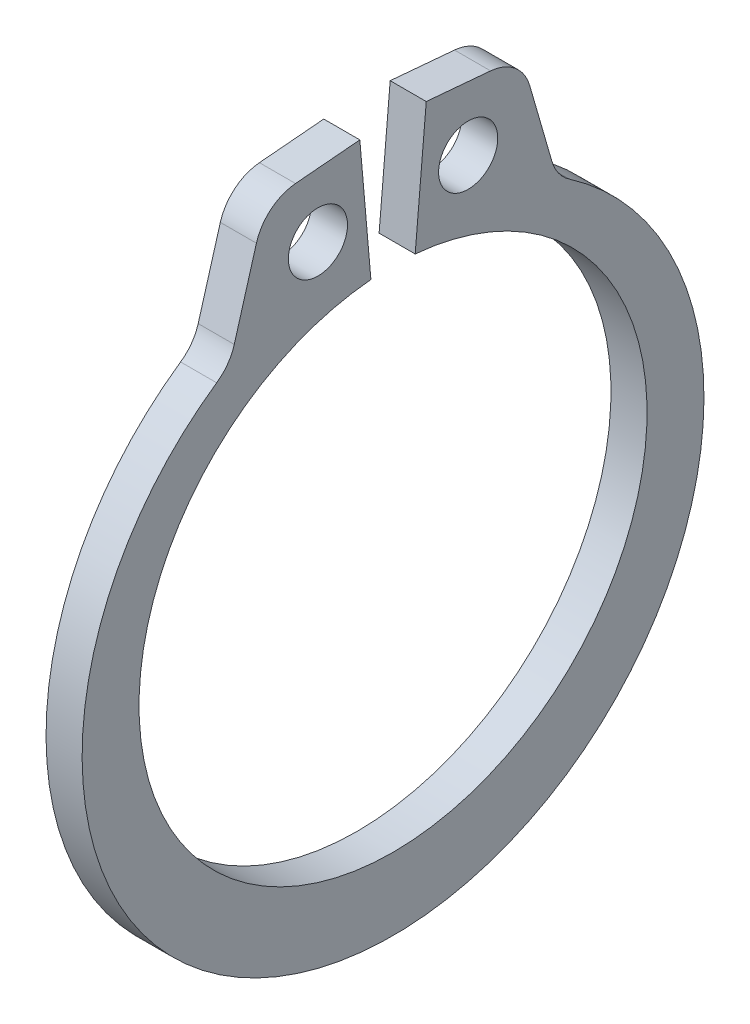
ISO-10303-21;
HEADER;
FILE_DESCRIPTION(('STEP AP214'),'2;1');
FILE_NAME('part.step','',(''),(''),'','','');
FILE_SCHEMA(('AUTOMOTIVE_DESIGN { 1 0 10303 214 1 1 1 1 }'));
ENDSEC;
DATA;
#1=APPLICATION_CONTEXT('core data for automotive mechanical design processes');
#2=APPLICATION_PROTOCOL_DEFINITION('international standard','automotive_design',2000,#1);
#3=PRODUCT_CONTEXT('',#1,'mechanical');
#4=PRODUCT('Part','Part','',(#3));
#5=PRODUCT_RELATED_PRODUCT_CATEGORY('part','',(#4));
#6=PRODUCT_DEFINITION_FORMATION('','',#4);
#7=PRODUCT_DEFINITION_CONTEXT('part definition',#1,'design');
#8=PRODUCT_DEFINITION('design','',#6,#7);
#9=PRODUCT_DEFINITION_SHAPE('','',#8);
#10=(LENGTH_UNIT() NAMED_UNIT(*) SI_UNIT(.MILLI.,.METRE.));
#11=(NAMED_UNIT(*) PLANE_ANGLE_UNIT() SI_UNIT($,.RADIAN.));
#12=(NAMED_UNIT(*) SI_UNIT($,.STERADIAN.) SOLID_ANGLE_UNIT());
#13=UNCERTAINTY_MEASURE_WITH_UNIT(LENGTH_MEASURE(1.E-05),#10,'distance_accuracy_value','');
#14=(GEOMETRIC_REPRESENTATION_CONTEXT(3) GLOBAL_UNCERTAINTY_ASSIGNED_CONTEXT((#13)) GLOBAL_UNIT_ASSIGNED_CONTEXT((#10,
#11,#12)) REPRESENTATION_CONTEXT('',''));
#15=CARTESIAN_POINT('',(0.,0.,0.));
#16=DIRECTION('',(0.,0.,1.));
#17=DIRECTION('',(1.,0.,0.));
#18=AXIS2_PLACEMENT_3D('',#15,#16,#17);
#19=CARTESIAN_POINT('',(0.3175,0.,0.));
#20=DIRECTION('',(1.,0.,0.));
#21=DIRECTION('',(0.,0.,-1.));
#22=AXIS2_PLACEMENT_3D('',#19,#20,#21);
#23=PLANE('',#22);
#24=CARTESIAN_POINT('',(0.3175,5.49368202936559,1.32203668641442));
#25=DIRECTION('',(1.,0.,0.));
#26=DIRECTION('',(0.,0.,-1.));
#27=AXIS2_PLACEMENT_3D('',#24,#25,#26);
#28=CIRCLE('',#27,0.5207);
#29=CARTESIAN_POINT('',(0.3175,5.49368202936559,0.801336686414416));
#30=VERTEX_POINT('',#29);
#31=EDGE_CURVE('E223',#30,#30,#28,.T.);
#32=ORIENTED_EDGE('',*,*,#31,.F.);
#33=EDGE_LOOP('',(#32));
#34=FACE_BOUND('',#33,.T.);
#35=DIRECTION('',(0.,-0.0871557427476588,0.996194698091746));
#36=VECTOR('',#35,1.);
#37=CARTESIAN_POINT('',(0.3175,6.68008316752401,0.584431548568698));
#38=LINE('',#37,#36);
#39=CARTESIAN_POINT('',(0.3175,6.68008316752401,0.584431548568698));
#40=VERTEX_POINT('',#39);
#41=CARTESIAN_POINT('',(0.3175,6.58102849769202,1.71663160558108));
#42=VERTEX_POINT('',#41);
#43=EDGE_CURVE('E135',#40,#42,#38,.T.);
#44=ORIENTED_EDGE('',*,*,#43,.T.);
#45=CARTESIAN_POINT('',(0.3175,5.79662479241458,1.64800517374158));
#46=DIRECTION('',(1.,0.,0.));
#47=DIRECTION('',(0.,0.,-1.));
#48=AXIS2_PLACEMENT_3D('',#45,#46,#47);
#49=CIRCLE('',#48,0.7874);
#50=CARTESIAN_POINT('',(0.3175,6.0153466835661,2.40441742531548));
#51=VERTEX_POINT('',#50);
#52=EDGE_CURVE('E176',#42,#51,#49,.T.);
#53=ORIENTED_EDGE('',*,*,#52,.T.);
#54=DIRECTION('',(0.,-0.96064548078982,0.277777357317144));
#55=VECTOR('',#54,1.);
#56=CARTESIAN_POINT('',(0.3175,6.53397528038183,2.2544523404497));
#57=LINE('',#56,#55);
#58=CARTESIAN_POINT('',(0.3175,4.66724971906374,2.79422908809335));
#59=VERTEX_POINT('',#58);
#60=EDGE_CURVE('E215',#51,#59,#57,.T.);
#61=ORIENTED_EDGE('',*,*,#60,.T.);
#62=CARTESIAN_POINT('',(0.3175,4.88597161021526,3.55064133966726));
#63=DIRECTION('',(1.,0.,0.));
#64=DIRECTION('',(0.,0.,-1.));
#65=AXIS2_PLACEMENT_3D('',#62,#63,#64);
#66=CIRCLE('',#65,0.7874);
#67=CARTESIAN_POINT('',(0.3175,4.23752329507568,3.10397195120119));
#68=VERTEX_POINT('',#67);
#69=EDGE_CURVE('E183',#59,#68,#66,.F.);
#70=ORIENTED_EDGE('',*,*,#69,.T.);
#71=CARTESIAN_POINT('',(0.3175,-0.268640399976461,0.));
#72=DIRECTION('',(1.,0.,0.));
#73=DIRECTION('',(0.,0.,-1.));
#74=AXIS2_PLACEMENT_3D('',#71,#72,#73);
#75=CIRCLE('',#74,5.47175960002354);
#76=CARTESIAN_POINT('',(0.3175,4.23752329507568,-3.10397195120119));
#77=VERTEX_POINT('',#76);
#78=EDGE_CURVE('E208',#68,#77,#75,.T.);
#79=ORIENTED_EDGE('',*,*,#78,.T.);
#80=CARTESIAN_POINT('',(0.3175,4.88597161021526,-3.55064133966726));
#81=DIRECTION('',(1.,0.,0.));
#82=DIRECTION('',(0.,0.,-1.));
#83=AXIS2_PLACEMENT_3D('',#80,#81,#82);
#84=CIRCLE('',#83,0.7874);
#85=CARTESIAN_POINT('',(0.3175,4.66724971906374,-2.79422908809335));
#86=VERTEX_POINT('',#85);
#87=EDGE_CURVE('E11',#77,#86,#84,.F.);
#88=ORIENTED_EDGE('',*,*,#87,.T.);
#89=DIRECTION('',(0.,0.96064548078982,0.277777357317144));
#90=VECTOR('',#89,1.);
#91=CARTESIAN_POINT('',(0.3175,6.53397528038183,-2.2544523404497));
#92=LINE('',#91,#90);
#93=CARTESIAN_POINT('',(0.3175,6.0153466835661,-2.40441742531548));
#94=VERTEX_POINT('',#93);
#95=EDGE_CURVE('E207',#86,#94,#92,.T.);
#96=ORIENTED_EDGE('',*,*,#95,.T.);
#97=CARTESIAN_POINT('',(0.3175,5.79662479241458,-1.64800517374158));
#98=DIRECTION('',(1.,0.,0.));
#99=DIRECTION('',(0.,0.,-1.));
#100=AXIS2_PLACEMENT_3D('',#97,#98,#99);
#101=CIRCLE('',#100,0.7874);
#102=CARTESIAN_POINT('',(0.3175,6.58102849769202,-1.71663160558108));
#103=VERTEX_POINT('',#102);
#104=EDGE_CURVE('E51',#94,#103,#101,.T.);
#105=ORIENTED_EDGE('',*,*,#104,.T.);
#106=DIRECTION('',(0.,0.0871557427476583,0.996194698091746));
#107=VECTOR('',#106,1.);
#108=CARTESIAN_POINT('',(0.3175,6.68008316752401,-0.584431548568698));
#109=LINE('',#108,#107);
#110=CARTESIAN_POINT('',(0.3175,6.68008316752401,-0.584431548568698));
#111=VERTEX_POINT('',#110);
#112=EDGE_CURVE('E212',#103,#111,#109,.T.);
#113=ORIENTED_EDGE('',*,*,#112,.T.);
#114=DIRECTION('',(0.,-0.996194698091745,0.0871557427476584));
#115=VECTOR('',#114,1.);
#116=CARTESIAN_POINT('',(0.3175,4.45338877834934,-0.389621032379132));
#117=LINE('',#116,#115);
#118=CARTESIAN_POINT('',(0.3175,4.45338877834934,-0.389621032379132));
#119=VERTEX_POINT('',#118);
#120=EDGE_CURVE('E141',#111,#119,#117,.T.);
#121=ORIENTED_EDGE('',*,*,#120,.T.);
#122=CARTESIAN_POINT('',(0.3175,0.,0.));
#123=DIRECTION('',(-1.,0.,0.));
#124=DIRECTION('',(0.,0.,-1.));
#125=AXIS2_PLACEMENT_3D('',#122,#123,#124);
#126=CIRCLE('',#125,4.4704);
#127=CARTESIAN_POINT('',(0.3175,4.45338877834934,0.389621032379132));
#128=VERTEX_POINT('',#127);
#129=EDGE_CURVE('E136',#119,#128,#126,.T.);
#130=ORIENTED_EDGE('',*,*,#129,.T.);
#131=DIRECTION('',(0.,0.996194698091745,0.0871557427476584));
#132=VECTOR('',#131,1.);
#133=CARTESIAN_POINT('',(0.3175,4.45338877834934,0.389621032379132));
#134=LINE('',#133,#132);
#135=EDGE_CURVE('E127',#128,#40,#134,.T.);
#136=ORIENTED_EDGE('',*,*,#135,.T.);
#137=EDGE_LOOP('',(#44,#53,#61,#70,#79,#88,#96,#105,#113,#121,#130,#136));
#138=FACE_BOUND('',#137,.T.);
#139=CARTESIAN_POINT('',(0.3175,5.49368202936559,-1.32203668641442));
#140=DIRECTION('',(1.,0.,0.));
#141=DIRECTION('',(0.,0.,-1.));
#142=AXIS2_PLACEMENT_3D('',#139,#140,#141);
#143=CIRCLE('',#142,0.5207);
#144=CARTESIAN_POINT('',(0.3175,5.49368202936559,-1.84273668641442));
#145=VERTEX_POINT('',#144);
#146=EDGE_CURVE('E249',#145,#145,#143,.T.);
#147=ORIENTED_EDGE('',*,*,#146,.F.);
#148=EDGE_LOOP('',(#147));
#149=FACE_BOUND('',#148,.T.);
#150=ADVANCED_FACE('F36',(#34,#138,#149),#23,.T.);
#151=CARTESIAN_POINT('',(-0.3175,0.,0.));
#152=DIRECTION('',(1.,0.,0.));
#153=DIRECTION('',(0.,0.,-1.));
#154=AXIS2_PLACEMENT_3D('',#151,#152,#153);
#155=PLANE('',#154);
#156=DIRECTION('',(0.,-0.96064548078982,0.277777357317144));
#157=VECTOR('',#156,1.);
#158=CARTESIAN_POINT('',(-0.3175,6.53397528038183,2.2544523404497));
#159=LINE('',#158,#157);
#160=CARTESIAN_POINT('',(-0.3175,6.0153466835661,2.40441742531548));
#161=VERTEX_POINT('',#160);
#162=CARTESIAN_POINT('',(-0.3175,4.66724971906374,2.79422908809335));
#163=VERTEX_POINT('',#162);
#164=EDGE_CURVE('E202',#161,#163,#159,.T.);
#165=ORIENTED_EDGE('',*,*,#164,.F.);
#166=CARTESIAN_POINT('',(-0.3175,5.79662479241458,1.64800517374158));
#167=DIRECTION('',(1.,0.,0.));
#168=DIRECTION('',(0.,0.,-1.));
#169=AXIS2_PLACEMENT_3D('',#166,#167,#168);
#170=CIRCLE('',#169,0.7874);
#171=CARTESIAN_POINT('',(-0.3175,6.58102849769202,1.71663160558108));
#172=VERTEX_POINT('',#171);
#173=EDGE_CURVE('E172',#161,#172,#170,.F.);
#174=ORIENTED_EDGE('',*,*,#173,.T.);
#175=DIRECTION('',(0.,-0.0871557427476588,0.996194698091746));
#176=VECTOR('',#175,1.);
#177=CARTESIAN_POINT('',(-0.3175,6.68008316752401,0.584431548568698));
#178=LINE('',#177,#176);
#179=CARTESIAN_POINT('',(-0.3175,6.68008316752401,0.584431548568698));
#180=VERTEX_POINT('',#179);
#181=EDGE_CURVE('E225',#180,#172,#178,.T.);
#182=ORIENTED_EDGE('',*,*,#181,.F.);
#183=DIRECTION('',(0.,0.996194698091745,0.0871557427476584));
#184=VECTOR('',#183,1.);
#185=CARTESIAN_POINT('',(-0.3175,4.45338877834934,0.389621032379132));
#186=LINE('',#185,#184);
#187=CARTESIAN_POINT('',(-0.3175,4.45338877834934,0.389621032379132));
#188=VERTEX_POINT('',#187);
#189=EDGE_CURVE('E222',#188,#180,#186,.T.);
#190=ORIENTED_EDGE('',*,*,#189,.F.);
#191=CARTESIAN_POINT('',(-0.3175,0.,0.));
#192=DIRECTION('',(-1.,0.,0.));
#193=DIRECTION('',(0.,0.,-1.));
#194=AXIS2_PLACEMENT_3D('',#191,#192,#193);
#195=CIRCLE('',#194,4.4704);
#196=CARTESIAN_POINT('',(-0.3175,4.45338877834934,-0.389621032379132));
#197=VERTEX_POINT('',#196);
#198=EDGE_CURVE('E149',#197,#188,#195,.T.);
#199=ORIENTED_EDGE('',*,*,#198,.F.);
#200=DIRECTION('',(0.,-0.996194698091745,0.0871557427476584));
#201=VECTOR('',#200,1.);
#202=CARTESIAN_POINT('',(-0.3175,4.45338877834934,-0.389621032379132));
#203=LINE('',#202,#201);
#204=CARTESIAN_POINT('',(-0.3175,6.68008316752401,-0.584431548568698));
#205=VERTEX_POINT('',#204);
#206=EDGE_CURVE('E145',#205,#197,#203,.T.);
#207=ORIENTED_EDGE('',*,*,#206,.F.);
#208=DIRECTION('',(0.,0.0871557427476583,0.996194698091746));
#209=VECTOR('',#208,1.);
#210=CARTESIAN_POINT('',(-0.3175,6.68008316752401,-0.584431548568698));
#211=LINE('',#210,#209);
#212=CARTESIAN_POINT('',(-0.3175,6.58102849769202,-1.71663160558108));
#213=VERTEX_POINT('',#212);
#214=EDGE_CURVE('E230',#213,#205,#211,.T.);
#215=ORIENTED_EDGE('',*,*,#214,.F.);
#216=CARTESIAN_POINT('',(-0.3175,5.79662479241458,-1.64800517374158));
#217=DIRECTION('',(1.,0.,0.));
#218=DIRECTION('',(0.,0.,-1.));
#219=AXIS2_PLACEMENT_3D('',#216,#217,#218);
#220=CIRCLE('',#219,0.7874);
#221=CARTESIAN_POINT('',(-0.3175,6.0153466835661,-2.40441742531548));
#222=VERTEX_POINT('',#221);
#223=EDGE_CURVE('E170',#213,#222,#220,.F.);
#224=ORIENTED_EDGE('',*,*,#223,.T.);
#225=DIRECTION('',(0.,0.96064548078982,0.277777357317144));
#226=VECTOR('',#225,1.);
#227=CARTESIAN_POINT('',(-0.3175,6.53397528038183,-2.2544523404497));
#228=LINE('',#227,#226);
#229=CARTESIAN_POINT('',(-0.3175,4.66724971906374,-2.79422908809335));
#230=VERTEX_POINT('',#229);
#231=EDGE_CURVE('E193',#230,#222,#228,.T.);
#232=ORIENTED_EDGE('',*,*,#231,.F.);
#233=CARTESIAN_POINT('',(-0.3175,4.88597161021526,-3.55064133966726));
#234=DIRECTION('',(1.,0.,0.));
#235=DIRECTION('',(0.,0.,-1.));
#236=AXIS2_PLACEMENT_3D('',#233,#234,#235);
#237=CIRCLE('',#236,0.7874);
#238=CARTESIAN_POINT('',(-0.3175,4.23752329507568,-3.10397195120119));
#239=VERTEX_POINT('',#238);
#240=EDGE_CURVE('E44',#230,#239,#237,.T.);
#241=ORIENTED_EDGE('',*,*,#240,.T.);
#242=CARTESIAN_POINT('',(-0.3175,-0.268640399976461,0.));
#243=DIRECTION('',(1.,0.,0.));
#244=DIRECTION('',(0.,0.,-1.));
#245=AXIS2_PLACEMENT_3D('',#242,#243,#244);
#246=CIRCLE('',#245,5.47175960002354);
#247=CARTESIAN_POINT('',(-0.3175,4.23752329507568,3.10397195120119));
#248=VERTEX_POINT('',#247);
#249=EDGE_CURVE('E191',#248,#239,#246,.T.);
#250=ORIENTED_EDGE('',*,*,#249,.F.);
#251=CARTESIAN_POINT('',(-0.3175,4.88597161021526,3.55064133966726));
#252=DIRECTION('',(1.,0.,0.));
#253=DIRECTION('',(0.,0.,-1.));
#254=AXIS2_PLACEMENT_3D('',#251,#252,#253);
#255=CIRCLE('',#254,0.7874);
#256=EDGE_CURVE('E181',#248,#163,#255,.T.);
#257=ORIENTED_EDGE('',*,*,#256,.T.);
#258=EDGE_LOOP('',(#165,#174,#182,#190,#199,#207,#215,#224,#232,#241,#250,#257));
#259=FACE_BOUND('',#258,.T.);
#260=CARTESIAN_POINT('',(-0.3175,5.49368202936559,1.32203668641442));
#261=DIRECTION('',(1.,0.,0.));
#262=DIRECTION('',(0.,0.,-1.));
#263=AXIS2_PLACEMENT_3D('',#260,#261,#262);
#264=CIRCLE('',#263,0.5207);
#265=CARTESIAN_POINT('',(-0.3175,5.49368202936559,0.801336686414416));
#266=VERTEX_POINT('',#265);
#267=EDGE_CURVE('E246',#266,#266,#264,.T.);
#268=ORIENTED_EDGE('',*,*,#267,.T.);
#269=EDGE_LOOP('',(#268));
#270=FACE_BOUND('',#269,.T.);
#271=CARTESIAN_POINT('',(-0.3175,5.49368202936559,-1.32203668641442));
#272=DIRECTION('',(1.,0.,0.));
#273=DIRECTION('',(0.,0.,-1.));
#274=AXIS2_PLACEMENT_3D('',#271,#272,#273);
#275=CIRCLE('',#274,0.5207);
#276=CARTESIAN_POINT('',(-0.3175,5.49368202936559,-1.84273668641442));
#277=VERTEX_POINT('',#276);
#278=EDGE_CURVE('E252',#277,#277,#275,.T.);
#279=ORIENTED_EDGE('',*,*,#278,.T.);
#280=EDGE_LOOP('',(#279));
#281=FACE_BOUND('',#280,.T.);
#282=ADVANCED_FACE('F189',(#259,#270,#281),#155,.F.);
#283=CARTESIAN_POINT('',(0.3175,0.,0.));
#284=DIRECTION('',(-1.,0.,0.));
#285=DIRECTION('',(0.,0.,1.));
#286=AXIS2_PLACEMENT_3D('',#283,#284,#285);
#287=CYLINDRICAL_SURFACE('',#286,4.4704);
#288=ORIENTED_EDGE('',*,*,#198,.T.);
#289=DIRECTION('',(-1.,0.,0.));
#290=VECTOR('',#289,1.);
#291=CARTESIAN_POINT('',(0.3175,4.45338877834934,0.389621032379132));
#292=LINE('',#291,#290);
#293=EDGE_CURVE('E131',#128,#188,#292,.T.);
#294=ORIENTED_EDGE('',*,*,#293,.F.);
#295=ORIENTED_EDGE('',*,*,#129,.F.);
#296=DIRECTION('',(-1.,0.,0.));
#297=VECTOR('',#296,1.);
#298=CARTESIAN_POINT('',(0.3175,4.45338877834934,-0.389621032379132));
#299=LINE('',#298,#297);
#300=EDGE_CURVE('E220',#119,#197,#299,.T.);
#301=ORIENTED_EDGE('',*,*,#300,.T.);
#302=EDGE_LOOP('',(#288,#294,#295,#301));
#303=FACE_BOUND('',#302,.T.);
#304=ADVANCED_FACE('F147',(#303),#287,.F.);
#305=CARTESIAN_POINT('',(0.3175,4.45338877834934,0.389621032379132));
#306=DIRECTION('',(0.,-0.0871557427476584,0.996194698091746));
#307=DIRECTION('',(0.,-0.996194698091746,-0.0871557427476584));
#308=AXIS2_PLACEMENT_3D('',#305,#306,#307);
#309=PLANE('',#308);
#310=ORIENTED_EDGE('',*,*,#189,.T.);
#311=DIRECTION('',(-1.,0.,0.));
#312=VECTOR('',#311,1.);
#313=CARTESIAN_POINT('',(0.3175,6.68008316752401,0.584431548568698));
#314=LINE('',#313,#312);
#315=EDGE_CURVE('E134',#40,#180,#314,.T.);
#316=ORIENTED_EDGE('',*,*,#315,.F.);
#317=ORIENTED_EDGE('',*,*,#135,.F.);
#318=ORIENTED_EDGE('',*,*,#293,.T.);
#319=EDGE_LOOP('',(#310,#316,#317,#318));
#320=FACE_BOUND('',#319,.T.);
#321=ADVANCED_FACE('F129',(#320),#309,.F.);
#322=CARTESIAN_POINT('',(0.3175,6.68008316752401,0.584431548568698));
#323=DIRECTION('',(0.,-0.996194698091746,-0.0871557427476588));
#324=DIRECTION('',(0.,0.0871557427476588,-0.996194698091746));
#325=AXIS2_PLACEMENT_3D('',#322,#323,#324);
#326=PLANE('',#325);
#327=ORIENTED_EDGE('',*,*,#181,.T.);
#328=DIRECTION('',(-1.,0.,0.));
#329=VECTOR('',#328,1.);
#330=CARTESIAN_POINT('',(0.3175,6.58102849769202,1.71663160558108));
#331=LINE('',#330,#329);
#332=EDGE_CURVE('E59',#172,#42,#331,.F.);
#333=ORIENTED_EDGE('',*,*,#332,.T.);
#334=ORIENTED_EDGE('',*,*,#43,.F.);
#335=ORIENTED_EDGE('',*,*,#315,.T.);
#336=EDGE_LOOP('',(#327,#333,#334,#335));
#337=FACE_BOUND('',#336,.T.);
#338=ADVANCED_FACE('F241',(#337),#326,.F.);
#339=CARTESIAN_POINT('',(0.3175,6.53397528038183,2.2544523404497));
#340=DIRECTION('',(0.,-0.277777357317144,-0.96064548078982));
#341=DIRECTION('',(0.,0.96064548078982,-0.277777357317144));
#342=AXIS2_PLACEMENT_3D('',#339,#340,#341);
#343=PLANE('',#342);
#344=ORIENTED_EDGE('',*,*,#164,.T.);
#345=DIRECTION('',(1.,0.,0.));
#346=VECTOR('',#345,1.);
#347=CARTESIAN_POINT('',(0.3175,4.66724971906374,2.79422908809335));
#348=LINE('',#347,#346);
#349=EDGE_CURVE('E163',#163,#59,#348,.T.);
#350=ORIENTED_EDGE('',*,*,#349,.T.);
#351=ORIENTED_EDGE('',*,*,#60,.F.);
#352=DIRECTION('',(-1.,0.,0.));
#353=VECTOR('',#352,1.);
#354=CARTESIAN_POINT('',(0.3175,6.0153466835661,2.40441742531548));
#355=LINE('',#354,#353);
#356=EDGE_CURVE('E160',#51,#161,#355,.T.);
#357=ORIENTED_EDGE('',*,*,#356,.T.);
#358=EDGE_LOOP('',(#344,#350,#351,#357));
#359=FACE_BOUND('',#358,.T.);
#360=ADVANCED_FACE('F281',(#359),#343,.F.);
#361=CARTESIAN_POINT('',(0.3175,-0.268640399976461,0.));
#362=DIRECTION('',(-1.,0.,0.));
#363=DIRECTION('',(0.,0.,1.));
#364=AXIS2_PLACEMENT_3D('',#361,#362,#363);
#365=CYLINDRICAL_SURFACE('',#364,5.47175960002354);
#366=ORIENTED_EDGE('',*,*,#78,.F.);
#367=DIRECTION('',(-1.,0.,0.));
#368=VECTOR('',#367,1.);
#369=CARTESIAN_POINT('',(0.3175,4.23752329507568,3.1039719512012));
#370=LINE('',#369,#368);
#371=EDGE_CURVE('E152',#68,#248,#370,.T.);
#372=ORIENTED_EDGE('',*,*,#371,.T.);
#373=ORIENTED_EDGE('',*,*,#249,.T.);
#374=DIRECTION('',(-1.,0.,0.));
#375=VECTOR('',#374,1.);
#376=CARTESIAN_POINT('',(0.3175,4.23752329507568,-3.10397195120119));
#377=LINE('',#376,#375);
#378=EDGE_CURVE('E150',#239,#77,#377,.F.);
#379=ORIENTED_EDGE('',*,*,#378,.T.);
#380=EDGE_LOOP('',(#366,#372,#373,#379));
#381=FACE_BOUND('',#380,.T.);
#382=ADVANCED_FACE('F199',(#381),#365,.T.);
#383=CARTESIAN_POINT('',(0.3175,6.53397528038183,-2.2544523404497));
#384=DIRECTION('',(0.,-0.277777357317144,0.96064548078982));
#385=DIRECTION('',(0.,-0.96064548078982,-0.277777357317144));
#386=AXIS2_PLACEMENT_3D('',#383,#384,#385);
#387=PLANE('',#386);
#388=ORIENTED_EDGE('',*,*,#95,.F.);
#389=DIRECTION('',(1.,0.,0.));
#390=VECTOR('',#389,1.);
#391=CARTESIAN_POINT('',(-0.3175,4.66724971906374,-2.79422908809335));
#392=LINE('',#391,#390);
#393=EDGE_CURVE('E167',#86,#230,#392,.F.);
#394=ORIENTED_EDGE('',*,*,#393,.T.);
#395=ORIENTED_EDGE('',*,*,#231,.T.);
#396=DIRECTION('',(-1.,0.,0.));
#397=VECTOR('',#396,1.);
#398=CARTESIAN_POINT('',(0.3175,6.0153466835661,-2.40441742531548));
#399=LINE('',#398,#397);
#400=EDGE_CURVE('E165',#222,#94,#399,.F.);
#401=ORIENTED_EDGE('',*,*,#400,.T.);
#402=EDGE_LOOP('',(#388,#394,#395,#401));
#403=FACE_BOUND('',#402,.T.);
#404=ADVANCED_FACE('F210',(#403),#387,.F.);
#405=CARTESIAN_POINT('',(0.3175,6.68008316752401,-0.584431548568698));
#406=DIRECTION('',(0.,-0.996194698091746,0.0871557427476583));
#407=DIRECTION('',(0.,-0.0871557427476583,-0.996194698091746));
#408=AXIS2_PLACEMENT_3D('',#405,#406,#407);
#409=PLANE('',#408);
#410=ORIENTED_EDGE('',*,*,#112,.F.);
#411=DIRECTION('',(-1.,0.,0.));
#412=VECTOR('',#411,1.);
#413=CARTESIAN_POINT('',(0.3175,6.58102849769202,-1.71663160558108));
#414=LINE('',#413,#412);
#415=EDGE_CURVE('E178',#103,#213,#414,.T.);
#416=ORIENTED_EDGE('',*,*,#415,.T.);
#417=ORIENTED_EDGE('',*,*,#214,.T.);
#418=DIRECTION('',(-1.,0.,0.));
#419=VECTOR('',#418,1.);
#420=CARTESIAN_POINT('',(0.3175,6.68008316752401,-0.584431548568698));
#421=LINE('',#420,#419);
#422=EDGE_CURVE('E154',#111,#205,#421,.T.);
#423=ORIENTED_EDGE('',*,*,#422,.F.);
#424=EDGE_LOOP('',(#410,#416,#417,#423));
#425=FACE_BOUND('',#424,.T.);
#426=ADVANCED_FACE('F274',(#425),#409,.F.);
#427=CARTESIAN_POINT('',(0.3175,4.45338877834934,-0.389621032379132));
#428=DIRECTION('',(0.,-0.0871557427476584,-0.996194698091746));
#429=DIRECTION('',(0.,0.996194698091746,-0.0871557427476584));
#430=AXIS2_PLACEMENT_3D('',#427,#428,#429);
#431=PLANE('',#430);
#432=ORIENTED_EDGE('',*,*,#206,.T.);
#433=ORIENTED_EDGE('',*,*,#300,.F.);
#434=ORIENTED_EDGE('',*,*,#120,.F.);
#435=ORIENTED_EDGE('',*,*,#422,.T.);
#436=EDGE_LOOP('',(#432,#433,#434,#435));
#437=FACE_BOUND('',#436,.T.);
#438=ADVANCED_FACE('F237',(#437),#431,.F.);
#439=CARTESIAN_POINT('',(0.3175,5.49368202936559,1.32203668641442));
#440=DIRECTION('',(-1.,0.,0.));
#441=DIRECTION('',(0.,0.,1.));
#442=AXIS2_PLACEMENT_3D('',#439,#440,#441);
#443=CYLINDRICAL_SURFACE('',#442,0.5207);
#444=ORIENTED_EDGE('',*,*,#31,.T.);
#445=EDGE_LOOP('',(#444));
#446=FACE_BOUND('',#445,.T.);
#447=ORIENTED_EDGE('',*,*,#267,.F.);
#448=EDGE_LOOP('',(#447));
#449=FACE_BOUND('',#448,.T.);
#450=ADVANCED_FACE('F269',(#446,#449),#443,.F.);
#451=CARTESIAN_POINT('',(0.3175,5.49368202936559,-1.32203668641442));
#452=DIRECTION('',(-1.,0.,0.));
#453=DIRECTION('',(0.,0.,1.));
#454=AXIS2_PLACEMENT_3D('',#451,#452,#453);
#455=CYLINDRICAL_SURFACE('',#454,0.5207);
#456=ORIENTED_EDGE('',*,*,#146,.T.);
#457=EDGE_LOOP('',(#456));
#458=FACE_BOUND('',#457,.T.);
#459=ORIENTED_EDGE('',*,*,#278,.F.);
#460=EDGE_LOOP('',(#459));
#461=FACE_BOUND('',#460,.T.);
#462=ADVANCED_FACE('F258',(#458,#461),#455,.F.);
#463=CARTESIAN_POINT('',(0.3175,4.88597161021526,3.55064133966726));
#464=DIRECTION('',(-1.,0.,0.));
#465=DIRECTION('',(0.,0.,1.));
#466=AXIS2_PLACEMENT_3D('',#463,#464,#465);
#467=CYLINDRICAL_SURFACE('',#466,0.7874);
#468=ORIENTED_EDGE('',*,*,#69,.F.);
#469=ORIENTED_EDGE('',*,*,#349,.F.);
#470=ORIENTED_EDGE('',*,*,#256,.F.);
#471=ORIENTED_EDGE('',*,*,#371,.F.);
#472=EDGE_LOOP('',(#468,#469,#470,#471));
#473=FACE_BOUND('',#472,.T.);
#474=ADVANCED_FACE('F291',(#473),#467,.F.);
#475=CARTESIAN_POINT('',(0.3175,4.88597161021526,-3.55064133966726));
#476=DIRECTION('',(-1.,0.,0.));
#477=DIRECTION('',(0.,0.,1.));
#478=AXIS2_PLACEMENT_3D('',#475,#476,#477);
#479=CYLINDRICAL_SURFACE('',#478,0.7874);
#480=ORIENTED_EDGE('',*,*,#87,.F.);
#481=ORIENTED_EDGE('',*,*,#378,.F.);
#482=ORIENTED_EDGE('',*,*,#240,.F.);
#483=ORIENTED_EDGE('',*,*,#393,.F.);
#484=EDGE_LOOP('',(#480,#481,#482,#483));
#485=FACE_BOUND('',#484,.T.);
#486=ADVANCED_FACE('F205',(#485),#479,.F.);
#487=CARTESIAN_POINT('',(0.3175,5.79662479241458,1.64800517374158));
#488=DIRECTION('',(-1.,0.,0.));
#489=DIRECTION('',(0.,0.,1.));
#490=AXIS2_PLACEMENT_3D('',#487,#488,#489);
#491=CYLINDRICAL_SURFACE('',#490,0.7874);
#492=ORIENTED_EDGE('',*,*,#52,.F.);
#493=ORIENTED_EDGE('',*,*,#332,.F.);
#494=ORIENTED_EDGE('',*,*,#173,.F.);
#495=ORIENTED_EDGE('',*,*,#356,.F.);
#496=EDGE_LOOP('',(#492,#493,#494,#495));
#497=FACE_BOUND('',#496,.T.);
#498=ADVANCED_FACE('F296',(#497),#491,.T.);
#499=CARTESIAN_POINT('',(0.3175,5.79662479241458,-1.64800517374158));
#500=DIRECTION('',(-1.,0.,0.));
#501=DIRECTION('',(0.,0.,1.));
#502=AXIS2_PLACEMENT_3D('',#499,#500,#501);
#503=CYLINDRICAL_SURFACE('',#502,0.7874);
#504=ORIENTED_EDGE('',*,*,#104,.F.);
#505=ORIENTED_EDGE('',*,*,#400,.F.);
#506=ORIENTED_EDGE('',*,*,#223,.F.);
#507=ORIENTED_EDGE('',*,*,#415,.F.);
#508=EDGE_LOOP('',(#504,#505,#506,#507));
#509=FACE_BOUND('',#508,.T.);
#510=ADVANCED_FACE('F38',(#509),#503,.T.);
#511=CLOSED_SHELL('',(#150,#282,#304,#321,#338,#360,#382,#404,#426,#438,#450,#462,#474,#486,
#498,#510));
#512=MANIFOLD_SOLID_BREP('B2',#511);
#513=ADVANCED_BREP_SHAPE_REPRESENTATION('',(#18,#512),#14);
#514=SHAPE_DEFINITION_REPRESENTATION(#9,#513);
ENDSEC;
END-ISO-10303-21;
